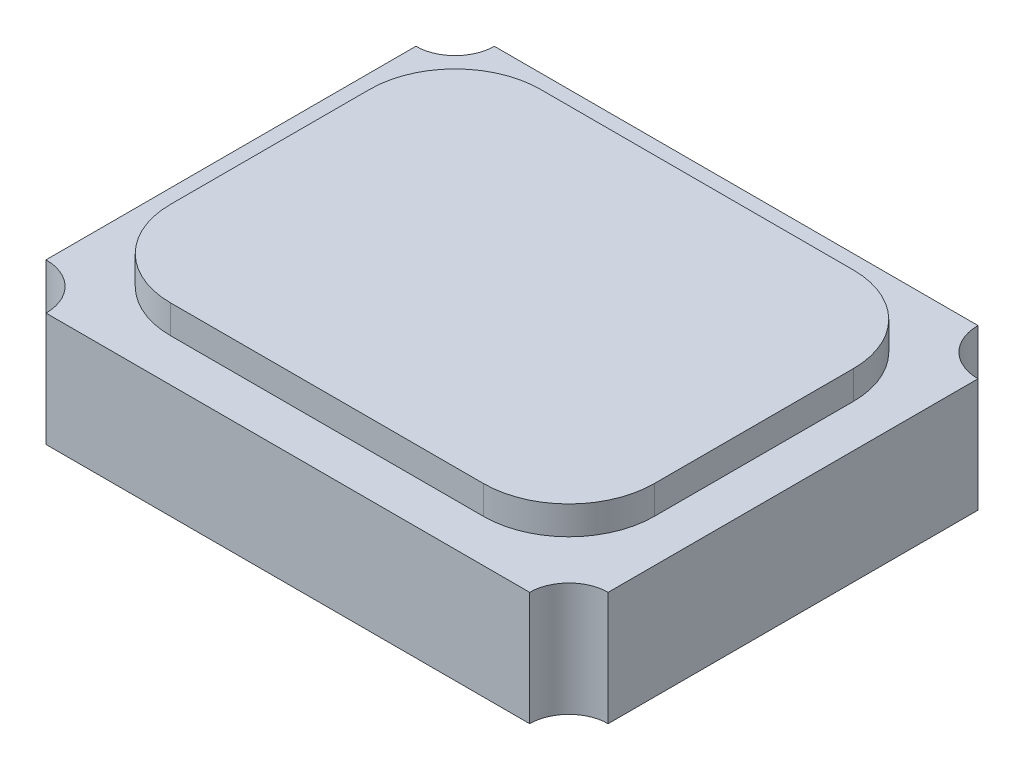
ISO-10303-21;
HEADER;
FILE_DESCRIPTION(('STEP AP214'),'2;1');
FILE_NAME('part.step','',(''),(''),'','','');
FILE_SCHEMA(('AUTOMOTIVE_DESIGN { 1 0 10303 214 1 1 1 1 }'));
ENDSEC;
DATA;
#1=APPLICATION_CONTEXT('core data for automotive mechanical design processes');
#2=APPLICATION_PROTOCOL_DEFINITION('international standard','automotive_design',2000,#1);
#3=PRODUCT_CONTEXT('',#1,'mechanical');
#4=PRODUCT('Part','Part','',(#3));
#5=PRODUCT_RELATED_PRODUCT_CATEGORY('part','',(#4));
#6=PRODUCT_DEFINITION_FORMATION('','',#4);
#7=PRODUCT_DEFINITION_CONTEXT('part definition',#1,'design');
#8=PRODUCT_DEFINITION('design','',#6,#7);
#9=PRODUCT_DEFINITION_SHAPE('','',#8);
#10=(LENGTH_UNIT() NAMED_UNIT(*) SI_UNIT(.MILLI.,.METRE.));
#11=(NAMED_UNIT(*) PLANE_ANGLE_UNIT() SI_UNIT($,.RADIAN.));
#12=(NAMED_UNIT(*) SI_UNIT($,.STERADIAN.) SOLID_ANGLE_UNIT());
#13=UNCERTAINTY_MEASURE_WITH_UNIT(LENGTH_MEASURE(1.E-05),#10,'distance_accuracy_value','');
#14=(GEOMETRIC_REPRESENTATION_CONTEXT(3) GLOBAL_UNCERTAINTY_ASSIGNED_CONTEXT((#13)) GLOBAL_UNIT_ASSIGNED_CONTEXT((#10,
#11,#12)) REPRESENTATION_CONTEXT('',''));
#15=CARTESIAN_POINT('',(0.,0.,0.));
#16=DIRECTION('',(0.,0.,1.));
#17=DIRECTION('',(1.,0.,0.));
#18=AXIS2_PLACEMENT_3D('',#15,#16,#17);
#19=CARTESIAN_POINT('',(0.,0.5,-1.6));
#20=DIRECTION('',(1.,0.,0.));
#21=DIRECTION('',(0.,0.,-1.));
#22=AXIS2_PLACEMENT_3D('',#19,#20,#21);
#23=PLANE('',#22);
#24=DIRECTION('',(0.,0.,1.));
#25=VECTOR('',#24,1.);
#26=CARTESIAN_POINT('',(0.,0.,-1.6));
#27=LINE('',#26,#25);
#28=CARTESIAN_POINT('',(0.,0.,-1.46211896344566));
#29=VERTEX_POINT('',#28);
#30=CARTESIAN_POINT('',(0.,0.,-0.162118963445657));
#31=VERTEX_POINT('',#30);
#32=EDGE_CURVE('E167',#29,#31,#27,.T.);
#33=ORIENTED_EDGE('',*,*,#32,.T.);
#34=DIRECTION('',(0.,1.,0.));
#35=VECTOR('',#34,1.);
#36=CARTESIAN_POINT('',(0.,0.,-0.162118963445657));
#37=LINE('',#36,#35);
#38=CARTESIAN_POINT('',(0.,0.4,-0.162118963445657));
#39=VERTEX_POINT('',#38);
#40=EDGE_CURVE('E148',#31,#39,#37,.T.);
#41=ORIENTED_EDGE('',*,*,#40,.T.);
#42=DIRECTION('',(0.,0.,1.));
#43=VECTOR('',#42,1.);
#44=CARTESIAN_POINT('',(0.,0.4,0.));
#45=LINE('',#44,#43);
#46=CARTESIAN_POINT('',(0.,0.4,-1.46211896344566));
#47=VERTEX_POINT('',#46);
#48=EDGE_CURVE('E193',#47,#39,#45,.T.);
#49=ORIENTED_EDGE('',*,*,#48,.F.);
#50=DIRECTION('',(0.,1.,0.));
#51=VECTOR('',#50,1.);
#52=CARTESIAN_POINT('',(0.,0.,-1.46211896344566));
#53=LINE('',#52,#51);
#54=EDGE_CURVE('E263',#29,#47,#53,.T.);
#55=ORIENTED_EDGE('',*,*,#54,.F.);
#56=EDGE_LOOP('',(#33,#41,#49,#55));
#57=FACE_BOUND('',#56,.T.);
#58=ADVANCED_FACE('F35',(#57),#23,.F.);
#59=CARTESIAN_POINT('',(0.,0.5,0.));
#60=DIRECTION('',(0.,0.,-1.));
#61=DIRECTION('',(-1.,0.,0.));
#62=AXIS2_PLACEMENT_3D('',#59,#60,#61);
#63=PLANE('',#62);
#64=DIRECTION('',(1.,0.,0.));
#65=VECTOR('',#64,1.);
#66=CARTESIAN_POINT('',(2.,0.4,0.));
#67=LINE('',#66,#65);
#68=CARTESIAN_POINT('',(0.162118963445657,0.4,0.));
#69=VERTEX_POINT('',#68);
#70=CARTESIAN_POINT('',(1.86211896344566,0.4,0.));
#71=VERTEX_POINT('',#70);
#72=EDGE_CURVE('E160',#69,#71,#67,.T.);
#73=ORIENTED_EDGE('',*,*,#72,.F.);
#74=DIRECTION('',(0.,1.,0.));
#75=VECTOR('',#74,1.);
#76=CARTESIAN_POINT('',(0.162118963445657,0.,0.));
#77=LINE('',#76,#75);
#78=CARTESIAN_POINT('',(0.162118963445657,0.,0.));
#79=VERTEX_POINT('',#78);
#80=EDGE_CURVE('E49',#79,#69,#77,.T.);
#81=ORIENTED_EDGE('',*,*,#80,.F.);
#82=DIRECTION('',(1.,0.,0.));
#83=VECTOR('',#82,1.);
#84=CARTESIAN_POINT('',(0.,0.,0.));
#85=LINE('',#84,#83);
#86=CARTESIAN_POINT('',(1.86211896344566,0.,0.));
#87=VERTEX_POINT('',#86);
#88=EDGE_CURVE('E158',#79,#87,#85,.T.);
#89=ORIENTED_EDGE('',*,*,#88,.T.);
#90=DIRECTION('',(0.,1.,0.));
#91=VECTOR('',#90,1.);
#92=CARTESIAN_POINT('',(1.86211896344566,0.,0.));
#93=LINE('',#92,#91);
#94=EDGE_CURVE('E276',#87,#71,#93,.T.);
#95=ORIENTED_EDGE('',*,*,#94,.T.);
#96=EDGE_LOOP('',(#73,#81,#89,#95));
#97=FACE_BOUND('',#96,.T.);
#98=ADVANCED_FACE('F156',(#97),#63,.F.);
#99=CARTESIAN_POINT('',(2.,0.5,0.));
#100=DIRECTION('',(-1.,0.,0.));
#101=DIRECTION('',(0.,0.,1.));
#102=AXIS2_PLACEMENT_3D('',#99,#100,#101);
#103=PLANE('',#102);
#104=DIRECTION('',(0.,0.,-1.));
#105=VECTOR('',#104,1.);
#106=CARTESIAN_POINT('',(2.,0.4,-1.6));
#107=LINE('',#106,#105);
#108=CARTESIAN_POINT('',(2.,0.4,-0.137881036554343));
#109=VERTEX_POINT('',#108);
#110=CARTESIAN_POINT('',(2.,0.4,-1.43788103655434));
#111=VERTEX_POINT('',#110);
#112=EDGE_CURVE('E185',#109,#111,#107,.T.);
#113=ORIENTED_EDGE('',*,*,#112,.F.);
#114=DIRECTION('',(0.,1.,0.));
#115=VECTOR('',#114,1.);
#116=CARTESIAN_POINT('',(2.,0.,-0.137881036554343));
#117=LINE('',#116,#115);
#118=CARTESIAN_POINT('',(2.,0.,-0.137881036554343));
#119=VERTEX_POINT('',#118);
#120=EDGE_CURVE('E56',#119,#109,#117,.T.);
#121=ORIENTED_EDGE('',*,*,#120,.F.);
#122=DIRECTION('',(0.,0.,-1.));
#123=VECTOR('',#122,1.);
#124=CARTESIAN_POINT('',(2.,0.,0.));
#125=LINE('',#124,#123);
#126=CARTESIAN_POINT('',(2.,0.,-1.43788103655434));
#127=VERTEX_POINT('',#126);
#128=EDGE_CURVE('E166',#119,#127,#125,.T.);
#129=ORIENTED_EDGE('',*,*,#128,.T.);
#130=DIRECTION('',(0.,1.,0.));
#131=VECTOR('',#130,1.);
#132=CARTESIAN_POINT('',(2.,0.,-1.43788103655434));
#133=LINE('',#132,#131);
#134=EDGE_CURVE('E191',#127,#111,#133,.T.);
#135=ORIENTED_EDGE('',*,*,#134,.T.);
#136=EDGE_LOOP('',(#113,#121,#129,#135));
#137=FACE_BOUND('',#136,.T.);
#138=ADVANCED_FACE('F189',(#137),#103,.F.);
#139=CARTESIAN_POINT('',(2.,0.5,-1.6));
#140=DIRECTION('',(0.,0.,1.));
#141=DIRECTION('',(1.,0.,0.));
#142=AXIS2_PLACEMENT_3D('',#139,#140,#141);
#143=PLANE('',#142);
#144=DIRECTION('',(-1.,0.,0.));
#145=VECTOR('',#144,1.);
#146=CARTESIAN_POINT('',(0.,0.4,-1.6));
#147=LINE('',#146,#145);
#148=CARTESIAN_POINT('',(1.83788103655434,0.4,-1.6));
#149=VERTEX_POINT('',#148);
#150=CARTESIAN_POINT('',(0.137881036554343,0.4,-1.6));
#151=VERTEX_POINT('',#150);
#152=EDGE_CURVE('E171',#149,#151,#147,.T.);
#153=ORIENTED_EDGE('',*,*,#152,.F.);
#154=DIRECTION('',(0.,1.,0.));
#155=VECTOR('',#154,1.);
#156=CARTESIAN_POINT('',(1.83788103655434,0.,-1.6));
#157=LINE('',#156,#155);
#158=CARTESIAN_POINT('',(1.83788103655434,0.,-1.6));
#159=VERTEX_POINT('',#158);
#160=EDGE_CURVE('E270',#159,#149,#157,.T.);
#161=ORIENTED_EDGE('',*,*,#160,.F.);
#162=DIRECTION('',(-1.,0.,0.));
#163=VECTOR('',#162,1.);
#164=CARTESIAN_POINT('',(2.,0.,-1.6));
#165=LINE('',#164,#163);
#166=CARTESIAN_POINT('',(0.137881036554343,0.,-1.6));
#167=VERTEX_POINT('',#166);
#168=EDGE_CURVE('E169',#159,#167,#165,.T.);
#169=ORIENTED_EDGE('',*,*,#168,.T.);
#170=DIRECTION('',(0.,1.,0.));
#171=VECTOR('',#170,1.);
#172=CARTESIAN_POINT('',(0.137881036554343,0.,-1.6));
#173=LINE('',#172,#171);
#174=EDGE_CURVE('E240',#167,#151,#173,.T.);
#175=ORIENTED_EDGE('',*,*,#174,.T.);
#176=EDGE_LOOP('',(#153,#161,#169,#175));
#177=FACE_BOUND('',#176,.T.);
#178=ADVANCED_FACE('F289',(#177),#143,.F.);
#179=CARTESIAN_POINT('',(0.,0.,0.));
#180=DIRECTION('',(0.,1.,0.));
#181=DIRECTION('',(0.,0.,1.));
#182=AXIS2_PLACEMENT_3D('',#179,#180,#181);
#183=PLANE('',#182);
#184=ORIENTED_EDGE('',*,*,#88,.F.);
#185=CARTESIAN_POINT('',(0.,0.,0.));
#186=DIRECTION('',(0.,1.,0.));
#187=DIRECTION('',(0.,0.,1.));
#188=AXIS2_PLACEMENT_3D('',#185,#186,#187);
#189=CIRCLE('',#188,0.162118963445657);
#190=EDGE_CURVE('E145',#79,#31,#189,.T.);
#191=ORIENTED_EDGE('',*,*,#190,.T.);
#192=ORIENTED_EDGE('',*,*,#32,.F.);
#193=CARTESIAN_POINT('',(0.,0.,-1.6));
#194=DIRECTION('',(0.,1.,0.));
#195=DIRECTION('',(0.,0.,1.));
#196=AXIS2_PLACEMENT_3D('',#193,#194,#195);
#197=CIRCLE('',#196,0.137881036554343);
#198=EDGE_CURVE('E265',#29,#167,#197,.T.);
#199=ORIENTED_EDGE('',*,*,#198,.T.);
#200=ORIENTED_EDGE('',*,*,#168,.F.);
#201=CARTESIAN_POINT('',(2.,0.,-1.6));
#202=DIRECTION('',(0.,1.,0.));
#203=DIRECTION('',(0.,0.,1.));
#204=AXIS2_PLACEMENT_3D('',#201,#202,#203);
#205=CIRCLE('',#204,0.162118963445657);
#206=EDGE_CURVE('E272',#159,#127,#205,.T.);
#207=ORIENTED_EDGE('',*,*,#206,.T.);
#208=ORIENTED_EDGE('',*,*,#128,.F.);
#209=CARTESIAN_POINT('',(2.,0.,0.));
#210=DIRECTION('',(0.,1.,0.));
#211=DIRECTION('',(0.,0.,1.));
#212=AXIS2_PLACEMENT_3D('',#209,#210,#211);
#213=CIRCLE('',#212,0.137881036554343);
#214=EDGE_CURVE('E165',#119,#87,#213,.T.);
#215=ORIENTED_EDGE('',*,*,#214,.T.);
#216=EDGE_LOOP('',(#184,#191,#192,#199,#200,#207,#208,#215));
#217=FACE_BOUND('',#216,.T.);
#218=ADVANCED_FACE('F163',(#217),#183,.F.);
#219=CARTESIAN_POINT('',(0.,0.4,0.));
#220=DIRECTION('',(0.,-1.,0.));
#221=DIRECTION('',(0.,0.,-1.));
#222=AXIS2_PLACEMENT_3D('',#219,#220,#221);
#223=PLANE('',#222);
#224=CARTESIAN_POINT('',(1.55,0.4,-1.15));
#225=DIRECTION('',(0.,1.,0.));
#226=DIRECTION('',(0.,0.,-1.));
#227=AXIS2_PLACEMENT_3D('',#224,#225,#226);
#228=CIRCLE('',#227,0.3);
#229=CARTESIAN_POINT('',(1.85,0.4,-1.15));
#230=VERTEX_POINT('',#229);
#231=CARTESIAN_POINT('',(1.55,0.4,-1.45));
#232=VERTEX_POINT('',#231);
#233=EDGE_CURVE('E218',#230,#232,#228,.T.);
#234=ORIENTED_EDGE('',*,*,#233,.F.);
#235=DIRECTION('',(0.,0.,-1.));
#236=VECTOR('',#235,1.);
#237=CARTESIAN_POINT('',(1.85,0.4,-1.15));
#238=LINE('',#237,#236);
#239=CARTESIAN_POINT('',(1.85,0.4,-0.450000000000002));
#240=VERTEX_POINT('',#239);
#241=EDGE_CURVE('E201',#240,#230,#238,.T.);
#242=ORIENTED_EDGE('',*,*,#241,.F.);
#243=CARTESIAN_POINT('',(1.55,0.4,-0.45));
#244=DIRECTION('',(0.,1.,0.));
#245=DIRECTION('',(0.,0.,-1.));
#246=AXIS2_PLACEMENT_3D('',#243,#244,#245);
#247=CIRCLE('',#246,0.3);
#248=CARTESIAN_POINT('',(1.55,0.4,-0.15));
#249=VERTEX_POINT('',#248);
#250=EDGE_CURVE('E243',#249,#240,#247,.T.);
#251=ORIENTED_EDGE('',*,*,#250,.F.);
#252=DIRECTION('',(1.,0.,0.));
#253=VECTOR('',#252,1.);
#254=CARTESIAN_POINT('',(1.55,0.4,-0.15));
#255=LINE('',#254,#253);
#256=CARTESIAN_POINT('',(0.450000000000002,0.4,-0.15));
#257=VERTEX_POINT('',#256);
#258=EDGE_CURVE('E246',#257,#249,#255,.T.);
#259=ORIENTED_EDGE('',*,*,#258,.F.);
#260=CARTESIAN_POINT('',(0.45,0.4,-0.45));
#261=DIRECTION('',(0.,1.,0.));
#262=DIRECTION('',(0.,0.,-1.));
#263=AXIS2_PLACEMENT_3D('',#260,#261,#262);
#264=CIRCLE('',#263,0.3);
#265=CARTESIAN_POINT('',(0.15,0.4,-0.450000000000002));
#266=VERTEX_POINT('',#265);
#267=EDGE_CURVE('E249',#266,#257,#264,.T.);
#268=ORIENTED_EDGE('',*,*,#267,.F.);
#269=DIRECTION('',(0.,0.,1.));
#270=VECTOR('',#269,1.);
#271=CARTESIAN_POINT('',(0.15,0.4,-0.450000000000002));
#272=LINE('',#271,#270);
#273=CARTESIAN_POINT('',(0.15,0.4,-1.15));
#274=VERTEX_POINT('',#273);
#275=EDGE_CURVE('E252',#274,#266,#272,.T.);
#276=ORIENTED_EDGE('',*,*,#275,.F.);
#277=CARTESIAN_POINT('',(0.45,0.4,-1.15));
#278=DIRECTION('',(0.,1.,0.));
#279=DIRECTION('',(0.,0.,-1.));
#280=AXIS2_PLACEMENT_3D('',#277,#278,#279);
#281=CIRCLE('',#280,0.3);
#282=CARTESIAN_POINT('',(0.450000000000002,0.4,-1.45));
#283=VERTEX_POINT('',#282);
#284=EDGE_CURVE('E255',#283,#274,#281,.T.);
#285=ORIENTED_EDGE('',*,*,#284,.F.);
#286=DIRECTION('',(-1.,0.,0.));
#287=VECTOR('',#286,1.);
#288=CARTESIAN_POINT('',(0.450000000000002,0.4,-1.45));
#289=LINE('',#288,#287);
#290=EDGE_CURVE('E258',#232,#283,#289,.T.);
#291=ORIENTED_EDGE('',*,*,#290,.F.);
#292=EDGE_LOOP('',(#234,#242,#251,#259,#268,#276,#285,#291));
#293=FACE_BOUND('',#292,.T.);
#294=ORIENTED_EDGE('',*,*,#48,.T.);
#295=CARTESIAN_POINT('',(0.,0.4,0.));
#296=DIRECTION('',(0.,-1.,0.));
#297=DIRECTION('',(0.,0.,-1.));
#298=AXIS2_PLACEMENT_3D('',#295,#296,#297);
#299=CIRCLE('',#298,0.162118963445657);
#300=EDGE_CURVE('E11',#39,#69,#299,.T.);
#301=ORIENTED_EDGE('',*,*,#300,.T.);
#302=ORIENTED_EDGE('',*,*,#72,.T.);
#303=CARTESIAN_POINT('',(2.,0.4,0.));
#304=DIRECTION('',(0.,-1.,0.));
#305=DIRECTION('',(0.,0.,-1.));
#306=AXIS2_PLACEMENT_3D('',#303,#304,#305);
#307=CIRCLE('',#306,0.137881036554343);
#308=EDGE_CURVE('E42',#71,#109,#307,.T.);
#309=ORIENTED_EDGE('',*,*,#308,.T.);
#310=ORIENTED_EDGE('',*,*,#112,.T.);
#311=CARTESIAN_POINT('',(2.,0.4,-1.6));
#312=DIRECTION('',(0.,-1.,0.));
#313=DIRECTION('',(0.,0.,-1.));
#314=AXIS2_PLACEMENT_3D('',#311,#312,#313);
#315=CIRCLE('',#314,0.162118963445657);
#316=EDGE_CURVE('E179',#111,#149,#315,.T.);
#317=ORIENTED_EDGE('',*,*,#316,.T.);
#318=ORIENTED_EDGE('',*,*,#152,.T.);
#319=CARTESIAN_POINT('',(0.,0.4,-1.6));
#320=DIRECTION('',(0.,-1.,0.));
#321=DIRECTION('',(0.,0.,-1.));
#322=AXIS2_PLACEMENT_3D('',#319,#320,#321);
#323=CIRCLE('',#322,0.137881036554343);
#324=EDGE_CURVE('E176',#151,#47,#323,.T.);
#325=ORIENTED_EDGE('',*,*,#324,.T.);
#326=EDGE_LOOP('',(#294,#301,#302,#309,#310,#317,#318,#325));
#327=FACE_BOUND('',#326,.T.);
#328=ADVANCED_FACE('F184',(#293,#327),#223,.F.);
#329=CARTESIAN_POINT('',(1.55,0.4,-1.15));
#330=DIRECTION('',(0.,1.,0.));
#331=DIRECTION('',(0.,0.,1.));
#332=AXIS2_PLACEMENT_3D('',#329,#330,#331);
#333=CYLINDRICAL_SURFACE('',#332,0.3);
#334=CARTESIAN_POINT('',(1.55,0.5,-1.15));
#335=DIRECTION('',(0.,1.,0.));
#336=DIRECTION('',(0.,0.,-1.));
#337=AXIS2_PLACEMENT_3D('',#334,#335,#336);
#338=CIRCLE('',#337,0.3);
#339=CARTESIAN_POINT('',(1.85,0.5,-1.15));
#340=VERTEX_POINT('',#339);
#341=CARTESIAN_POINT('',(1.55,0.5,-1.45));
#342=VERTEX_POINT('',#341);
#343=EDGE_CURVE('E237',#340,#342,#338,.T.);
#344=ORIENTED_EDGE('',*,*,#343,.F.);
#345=DIRECTION('',(0.,1.,0.));
#346=VECTOR('',#345,1.);
#347=CARTESIAN_POINT('',(1.85,0.4,-1.15));
#348=LINE('',#347,#346);
#349=EDGE_CURVE('E197',#230,#340,#348,.T.);
#350=ORIENTED_EDGE('',*,*,#349,.F.);
#351=ORIENTED_EDGE('',*,*,#233,.T.);
#352=DIRECTION('',(0.,1.,0.));
#353=VECTOR('',#352,1.);
#354=CARTESIAN_POINT('',(1.55,0.4,-1.45));
#355=LINE('',#354,#353);
#356=EDGE_CURVE('E198',#232,#342,#355,.T.);
#357=ORIENTED_EDGE('',*,*,#356,.T.);
#358=EDGE_LOOP('',(#344,#350,#351,#357));
#359=FACE_BOUND('',#358,.T.);
#360=ADVANCED_FACE('F323',(#359),#333,.T.);
#361=CARTESIAN_POINT('',(1.85,0.4,-1.15));
#362=DIRECTION('',(1.,0.,0.));
#363=DIRECTION('',(0.,0.,-1.));
#364=AXIS2_PLACEMENT_3D('',#361,#362,#363);
#365=PLANE('',#364);
#366=DIRECTION('',(0.,0.,-1.));
#367=VECTOR('',#366,1.);
#368=CARTESIAN_POINT('',(1.85,0.5,-1.15));
#369=LINE('',#368,#367);
#370=CARTESIAN_POINT('',(1.85,0.5,-0.450000000000002));
#371=VERTEX_POINT('',#370);
#372=EDGE_CURVE('E215',#371,#340,#369,.T.);
#373=ORIENTED_EDGE('',*,*,#372,.F.);
#374=DIRECTION('',(0.,1.,0.));
#375=VECTOR('',#374,1.);
#376=CARTESIAN_POINT('',(1.85,0.4,-0.450000000000002));
#377=LINE('',#376,#375);
#378=EDGE_CURVE('E212',#240,#371,#377,.T.);
#379=ORIENTED_EDGE('',*,*,#378,.F.);
#380=ORIENTED_EDGE('',*,*,#241,.T.);
#381=ORIENTED_EDGE('',*,*,#349,.T.);
#382=EDGE_LOOP('',(#373,#379,#380,#381));
#383=FACE_BOUND('',#382,.T.);
#384=ADVANCED_FACE('F327',(#383),#365,.T.);
#385=CARTESIAN_POINT('',(1.55,0.4,-0.45));
#386=DIRECTION('',(0.,1.,0.));
#387=DIRECTION('',(0.,0.,1.));
#388=AXIS2_PLACEMENT_3D('',#385,#386,#387);
#389=CYLINDRICAL_SURFACE('',#388,0.3);
#390=CARTESIAN_POINT('',(1.55,0.5,-0.45));
#391=DIRECTION('',(0.,1.,0.));
#392=DIRECTION('',(0.,0.,-1.));
#393=AXIS2_PLACEMENT_3D('',#390,#391,#392);
#394=CIRCLE('',#393,0.3);
#395=CARTESIAN_POINT('',(1.55,0.5,-0.15));
#396=VERTEX_POINT('',#395);
#397=EDGE_CURVE('E219',#396,#371,#394,.T.);
#398=ORIENTED_EDGE('',*,*,#397,.F.);
#399=DIRECTION('',(0.,1.,0.));
#400=VECTOR('',#399,1.);
#401=CARTESIAN_POINT('',(1.55,0.4,-0.15));
#402=LINE('',#401,#400);
#403=EDGE_CURVE('E210',#249,#396,#402,.T.);
#404=ORIENTED_EDGE('',*,*,#403,.F.);
#405=ORIENTED_EDGE('',*,*,#250,.T.);
#406=ORIENTED_EDGE('',*,*,#378,.T.);
#407=EDGE_LOOP('',(#398,#404,#405,#406));
#408=FACE_BOUND('',#407,.T.);
#409=ADVANCED_FACE('F347',(#408),#389,.T.);
#410=CARTESIAN_POINT('',(1.55,0.4,-0.15));
#411=DIRECTION('',(0.,0.,1.));
#412=DIRECTION('',(1.,0.,0.));
#413=AXIS2_PLACEMENT_3D('',#410,#411,#412);
#414=PLANE('',#413);
#415=DIRECTION('',(1.,0.,0.));
#416=VECTOR('',#415,1.);
#417=CARTESIAN_POINT('',(1.55,0.5,-0.15));
#418=LINE('',#417,#416);
#419=CARTESIAN_POINT('',(0.450000000000002,0.5,-0.15));
#420=VERTEX_POINT('',#419);
#421=EDGE_CURVE('E222',#420,#396,#418,.T.);
#422=ORIENTED_EDGE('',*,*,#421,.F.);
#423=DIRECTION('',(0.,1.,0.));
#424=VECTOR('',#423,1.);
#425=CARTESIAN_POINT('',(0.450000000000002,0.4,-0.15));
#426=LINE('',#425,#424);
#427=EDGE_CURVE('E208',#257,#420,#426,.T.);
#428=ORIENTED_EDGE('',*,*,#427,.F.);
#429=ORIENTED_EDGE('',*,*,#258,.T.);
#430=ORIENTED_EDGE('',*,*,#403,.T.);
#431=EDGE_LOOP('',(#422,#428,#429,#430));
#432=FACE_BOUND('',#431,.T.);
#433=ADVANCED_FACE('F343',(#432),#414,.T.);
#434=CARTESIAN_POINT('',(0.45,0.4,-0.45));
#435=DIRECTION('',(0.,1.,0.));
#436=DIRECTION('',(0.,0.,1.));
#437=AXIS2_PLACEMENT_3D('',#434,#435,#436);
#438=CYLINDRICAL_SURFACE('',#437,0.3);
#439=CARTESIAN_POINT('',(0.45,0.5,-0.45));
#440=DIRECTION('',(0.,1.,0.));
#441=DIRECTION('',(0.,0.,-1.));
#442=AXIS2_PLACEMENT_3D('',#439,#440,#441);
#443=CIRCLE('',#442,0.3);
#444=CARTESIAN_POINT('',(0.15,0.5,-0.450000000000002));
#445=VERTEX_POINT('',#444);
#446=EDGE_CURVE('E225',#445,#420,#443,.T.);
#447=ORIENTED_EDGE('',*,*,#446,.F.);
#448=DIRECTION('',(0.,1.,0.));
#449=VECTOR('',#448,1.);
#450=CARTESIAN_POINT('',(0.15,0.4,-0.450000000000002));
#451=LINE('',#450,#449);
#452=EDGE_CURVE('E206',#266,#445,#451,.T.);
#453=ORIENTED_EDGE('',*,*,#452,.F.);
#454=ORIENTED_EDGE('',*,*,#267,.T.);
#455=ORIENTED_EDGE('',*,*,#427,.T.);
#456=EDGE_LOOP('',(#447,#453,#454,#455));
#457=FACE_BOUND('',#456,.T.);
#458=ADVANCED_FACE('F339',(#457),#438,.T.);
#459=CARTESIAN_POINT('',(0.15,0.4,-0.450000000000002));
#460=DIRECTION('',(-1.,0.,0.));
#461=DIRECTION('',(0.,0.,1.));
#462=AXIS2_PLACEMENT_3D('',#459,#460,#461);
#463=PLANE('',#462);
#464=DIRECTION('',(0.,0.,1.));
#465=VECTOR('',#464,1.);
#466=CARTESIAN_POINT('',(0.15,0.5,-0.450000000000002));
#467=LINE('',#466,#465);
#468=CARTESIAN_POINT('',(0.15,0.5,-1.15));
#469=VERTEX_POINT('',#468);
#470=EDGE_CURVE('E228',#469,#445,#467,.T.);
#471=ORIENTED_EDGE('',*,*,#470,.F.);
#472=DIRECTION('',(0.,1.,0.));
#473=VECTOR('',#472,1.);
#474=CARTESIAN_POINT('',(0.15,0.4,-1.15));
#475=LINE('',#474,#473);
#476=EDGE_CURVE('E204',#274,#469,#475,.T.);
#477=ORIENTED_EDGE('',*,*,#476,.F.);
#478=ORIENTED_EDGE('',*,*,#275,.T.);
#479=ORIENTED_EDGE('',*,*,#452,.T.);
#480=EDGE_LOOP('',(#471,#477,#478,#479));
#481=FACE_BOUND('',#480,.T.);
#482=ADVANCED_FACE('F335',(#481),#463,.T.);
#483=CARTESIAN_POINT('',(0.45,0.4,-1.15));
#484=DIRECTION('',(0.,1.,0.));
#485=DIRECTION('',(0.,0.,1.));
#486=AXIS2_PLACEMENT_3D('',#483,#484,#485);
#487=CYLINDRICAL_SURFACE('',#486,0.3);
#488=CARTESIAN_POINT('',(0.45,0.5,-1.15));
#489=DIRECTION('',(0.,1.,0.));
#490=DIRECTION('',(0.,0.,-1.));
#491=AXIS2_PLACEMENT_3D('',#488,#489,#490);
#492=CIRCLE('',#491,0.3);
#493=CARTESIAN_POINT('',(0.450000000000002,0.5,-1.45));
#494=VERTEX_POINT('',#493);
#495=EDGE_CURVE('E231',#494,#469,#492,.T.);
#496=ORIENTED_EDGE('',*,*,#495,.F.);
#497=DIRECTION('',(0.,1.,0.));
#498=VECTOR('',#497,1.);
#499=CARTESIAN_POINT('',(0.450000000000002,0.4,-1.45));
#500=LINE('',#499,#498);
#501=EDGE_CURVE('E200',#283,#494,#500,.T.);
#502=ORIENTED_EDGE('',*,*,#501,.F.);
#503=ORIENTED_EDGE('',*,*,#284,.T.);
#504=ORIENTED_EDGE('',*,*,#476,.T.);
#505=EDGE_LOOP('',(#496,#502,#503,#504));
#506=FACE_BOUND('',#505,.T.);
#507=ADVANCED_FACE('F331',(#506),#487,.T.);
#508=CARTESIAN_POINT('',(0.450000000000002,0.4,-1.45));
#509=DIRECTION('',(0.,0.,-1.));
#510=DIRECTION('',(-1.,0.,0.));
#511=AXIS2_PLACEMENT_3D('',#508,#509,#510);
#512=PLANE('',#511);
#513=DIRECTION('',(-1.,0.,0.));
#514=VECTOR('',#513,1.);
#515=CARTESIAN_POINT('',(0.450000000000002,0.5,-1.45));
#516=LINE('',#515,#514);
#517=EDGE_CURVE('E234',#342,#494,#516,.T.);
#518=ORIENTED_EDGE('',*,*,#517,.F.);
#519=ORIENTED_EDGE('',*,*,#356,.F.);
#520=ORIENTED_EDGE('',*,*,#290,.T.);
#521=ORIENTED_EDGE('',*,*,#501,.T.);
#522=EDGE_LOOP('',(#518,#519,#520,#521));
#523=FACE_BOUND('',#522,.T.);
#524=ADVANCED_FACE('F319',(#523),#512,.T.);
#525=CARTESIAN_POINT('',(0.,0.5,0.));
#526=DIRECTION('',(0.,1.,0.));
#527=DIRECTION('',(0.,0.,1.));
#528=AXIS2_PLACEMENT_3D('',#525,#526,#527);
#529=PLANE('',#528);
#530=ORIENTED_EDGE('',*,*,#372,.T.);
#531=ORIENTED_EDGE('',*,*,#343,.T.);
#532=ORIENTED_EDGE('',*,*,#517,.T.);
#533=ORIENTED_EDGE('',*,*,#495,.T.);
#534=ORIENTED_EDGE('',*,*,#470,.T.);
#535=ORIENTED_EDGE('',*,*,#446,.T.);
#536=ORIENTED_EDGE('',*,*,#421,.T.);
#537=ORIENTED_EDGE('',*,*,#397,.T.);
#538=EDGE_LOOP('',(#530,#531,#532,#533,#534,#535,#536,#537));
#539=FACE_BOUND('',#538,.T.);
#540=ADVANCED_FACE('F302',(#539),#529,.T.);
#541=CARTESIAN_POINT('',(0.,0.,-1.6));
#542=DIRECTION('',(0.,1.,0.));
#543=DIRECTION('',(0.,0.,1.));
#544=AXIS2_PLACEMENT_3D('',#541,#542,#543);
#545=CYLINDRICAL_SURFACE('',#544,0.137881036554343);
#546=ORIENTED_EDGE('',*,*,#174,.F.);
#547=ORIENTED_EDGE('',*,*,#198,.F.);
#548=ORIENTED_EDGE('',*,*,#54,.T.);
#549=ORIENTED_EDGE('',*,*,#324,.F.);
#550=EDGE_LOOP('',(#546,#547,#548,#549));
#551=FACE_BOUND('',#550,.T.);
#552=ADVANCED_FACE('F287',(#551),#545,.F.);
#553=CARTESIAN_POINT('',(2.,0.,-1.6));
#554=DIRECTION('',(0.,1.,0.));
#555=DIRECTION('',(0.,0.,1.));
#556=AXIS2_PLACEMENT_3D('',#553,#554,#555);
#557=CYLINDRICAL_SURFACE('',#556,0.162118963445657);
#558=ORIENTED_EDGE('',*,*,#134,.F.);
#559=ORIENTED_EDGE('',*,*,#206,.F.);
#560=ORIENTED_EDGE('',*,*,#160,.T.);
#561=ORIENTED_EDGE('',*,*,#316,.F.);
#562=EDGE_LOOP('',(#558,#559,#560,#561));
#563=FACE_BOUND('',#562,.T.);
#564=ADVANCED_FACE('F293',(#563),#557,.F.);
#565=CARTESIAN_POINT('',(2.,0.,0.));
#566=DIRECTION('',(0.,1.,0.));
#567=DIRECTION('',(0.,0.,1.));
#568=AXIS2_PLACEMENT_3D('',#565,#566,#567);
#569=CYLINDRICAL_SURFACE('',#568,0.137881036554343);
#570=ORIENTED_EDGE('',*,*,#94,.F.);
#571=ORIENTED_EDGE('',*,*,#214,.F.);
#572=ORIENTED_EDGE('',*,*,#120,.T.);
#573=ORIENTED_EDGE('',*,*,#308,.F.);
#574=EDGE_LOOP('',(#570,#571,#572,#573));
#575=FACE_BOUND('',#574,.T.);
#576=ADVANCED_FACE('F295',(#575),#569,.F.);
#577=CARTESIAN_POINT('',(0.,0.,0.));
#578=DIRECTION('',(0.,1.,0.));
#579=DIRECTION('',(0.,0.,1.));
#580=AXIS2_PLACEMENT_3D('',#577,#578,#579);
#581=CYLINDRICAL_SURFACE('',#580,0.162118963445657);
#582=ORIENTED_EDGE('',*,*,#40,.F.);
#583=ORIENTED_EDGE('',*,*,#190,.F.);
#584=ORIENTED_EDGE('',*,*,#80,.T.);
#585=ORIENTED_EDGE('',*,*,#300,.F.);
#586=EDGE_LOOP('',(#582,#583,#584,#585));
#587=FACE_BOUND('',#586,.T.);
#588=ADVANCED_FACE('F146',(#587),#581,.F.);
#589=CLOSED_SHELL('',(#58,#98,#138,#178,#218,#328,#360,#384,#409,#433,#458,#482,#507,#524,#540,
#552,#564,#576,#588));
#590=MANIFOLD_SOLID_BREP('B2',#589);
#591=ADVANCED_BREP_SHAPE_REPRESENTATION('',(#18,#590),#14);
#592=SHAPE_DEFINITION_REPRESENTATION(#9,#591);
ENDSEC;
END-ISO-10303-21;
